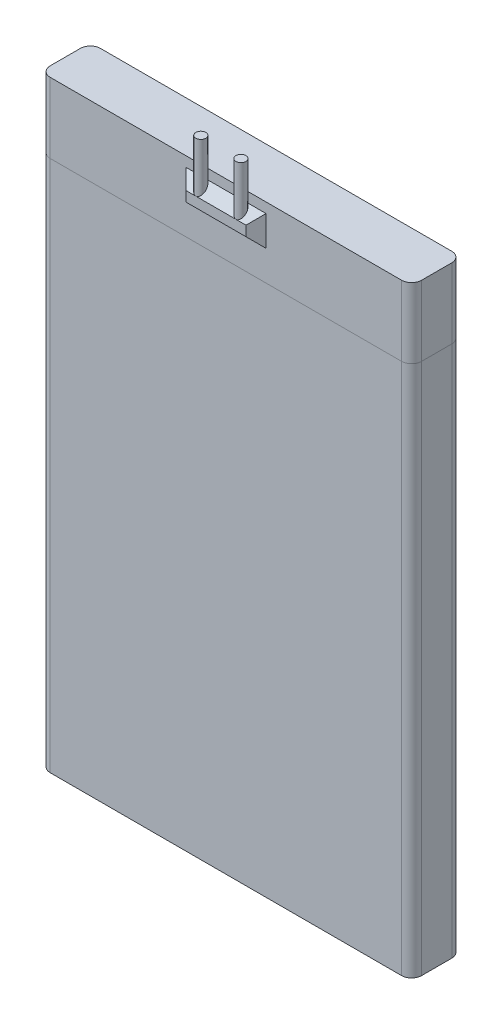
ISO-10303-21;
HEADER;
FILE_DESCRIPTION(('STEP AP214'),'2;1');
FILE_NAME('part.step','',(''),(''),'','','');
FILE_SCHEMA(('AUTOMOTIVE_DESIGN { 1 0 10303 214 1 1 1 1 }'));
ENDSEC;
DATA;
#1=APPLICATION_CONTEXT('core data for automotive mechanical design processes');
#2=APPLICATION_PROTOCOL_DEFINITION('international standard','automotive_design',2000,#1);
#3=PRODUCT_CONTEXT('',#1,'mechanical');
#4=PRODUCT('Part','Part','',(#3));
#5=PRODUCT_RELATED_PRODUCT_CATEGORY('part','',(#4));
#6=PRODUCT_DEFINITION_FORMATION('','',#4);
#7=PRODUCT_DEFINITION_CONTEXT('part definition',#1,'design');
#8=PRODUCT_DEFINITION('design','',#6,#7);
#9=PRODUCT_DEFINITION_SHAPE('','',#8);
#10=(LENGTH_UNIT() NAMED_UNIT(*) SI_UNIT(.MILLI.,.METRE.));
#11=(NAMED_UNIT(*) PLANE_ANGLE_UNIT() SI_UNIT($,.RADIAN.));
#12=(NAMED_UNIT(*) SI_UNIT($,.STERADIAN.) SOLID_ANGLE_UNIT());
#13=UNCERTAINTY_MEASURE_WITH_UNIT(LENGTH_MEASURE(1.E-05),#10,'distance_accuracy_value','');
#14=(GEOMETRIC_REPRESENTATION_CONTEXT(3) GLOBAL_UNCERTAINTY_ASSIGNED_CONTEXT((#13)) GLOBAL_UNIT_ASSIGNED_CONTEXT((#10,
#11,#12)) REPRESENTATION_CONTEXT('',''));
#15=CARTESIAN_POINT('',(0.,0.,0.));
#16=DIRECTION('',(0.,0.,1.));
#17=DIRECTION('',(1.,0.,0.));
#18=AXIS2_PLACEMENT_3D('',#15,#16,#17);
#19=CARTESIAN_POINT('',(0.,-3.5,0.));
#20=DIRECTION('',(0.,0.,1.));
#21=DIRECTION('',(1.,0.,0.));
#22=AXIS2_PLACEMENT_3D('',#19,#20,#21);
#23=PLANE('',#22);
#24=DIRECTION('',(0.,-1.,0.));
#25=VECTOR('',#24,1.);
#26=CARTESIAN_POINT('',(-17.5,9.75,0.));
#27=LINE('',#26,#25);
#28=CARTESIAN_POINT('',(-17.5,23.,0.));
#29=VERTEX_POINT('',#28);
#30=CARTESIAN_POINT('',(-17.5,-30.,0.));
#31=VERTEX_POINT('',#30);
#32=EDGE_CURVE('P0_E130',#29,#31,#27,.T.);
#33=ORIENTED_EDGE('',*,*,#32,.F.);
#34=DIRECTION('',(1.,0.,0.));
#35=VECTOR('',#34,1.);
#36=CARTESIAN_POINT('',(-18.5,23.,0.));
#37=LINE('',#36,#35);
#38=CARTESIAN_POINT('',(17.5,23.,0.));
#39=VERTEX_POINT('',#38);
#40=EDGE_CURVE('P0_E114',#29,#39,#37,.T.);
#41=ORIENTED_EDGE('',*,*,#40,.T.);
#42=DIRECTION('',(0.,1.,0.));
#43=VECTOR('',#42,1.);
#44=CARTESIAN_POINT('',(17.5,-16.75,0.));
#45=LINE('',#44,#43);
#46=CARTESIAN_POINT('',(17.5,-30.,0.));
#47=VERTEX_POINT('',#46);
#48=EDGE_CURVE('P0_E181',#47,#39,#45,.T.);
#49=ORIENTED_EDGE('',*,*,#48,.F.);
#50=DIRECTION('',(1.,0.,0.));
#51=VECTOR('',#50,1.);
#52=CARTESIAN_POINT('',(-18.5,-30.,0.));
#53=LINE('',#52,#51);
#54=EDGE_CURVE('P0_E11',#31,#47,#53,.T.);
#55=ORIENTED_EDGE('',*,*,#54,.F.);
#56=EDGE_LOOP('',(#33,#41,#49,#55));
#57=FACE_BOUND('',#56,.T.);
#58=ADVANCED_FACE('P0_F17',(#57),#23,.F.);
#59=CARTESIAN_POINT('',(-18.5,-30.,0.));
#60=DIRECTION('',(0.,-1.,0.));
#61=DIRECTION('',(0.,0.,-1.));
#62=AXIS2_PLACEMENT_3D('',#59,#60,#61);
#63=PLANE('',#62);
#64=CARTESIAN_POINT('',(-17.5,-30.,1.));
#65=DIRECTION('',(0.,1.,0.));
#66=DIRECTION('',(-0.707106781186548,0.,-0.707106781186547));
#67=AXIS2_PLACEMENT_3D('',#64,#65,#66);
#68=CIRCLE('',#67,1.);
#69=CARTESIAN_POINT('',(-18.5,-30.,1.));
#70=VERTEX_POINT('',#69);
#71=EDGE_CURVE('P0_E107',#31,#70,#68,.T.);
#72=ORIENTED_EDGE('',*,*,#71,.F.);
#73=ORIENTED_EDGE('',*,*,#54,.T.);
#74=CARTESIAN_POINT('',(17.5,-30.,1.));
#75=DIRECTION('',(0.,1.,0.));
#76=DIRECTION('',(0.707106781186548,0.,-0.707106781186547));
#77=AXIS2_PLACEMENT_3D('',#74,#75,#76);
#78=CIRCLE('',#77,1.);
#79=CARTESIAN_POINT('',(18.5,-30.,1.));
#80=VERTEX_POINT('',#79);
#81=EDGE_CURVE('P0_E177',#80,#47,#78,.T.);
#82=ORIENTED_EDGE('',*,*,#81,.F.);
#83=DIRECTION('',(0.,0.,1.));
#84=VECTOR('',#83,1.);
#85=CARTESIAN_POINT('',(18.5,-30.,0.));
#86=LINE('',#85,#84);
#87=CARTESIAN_POINT('',(18.5,-30.,4.));
#88=VERTEX_POINT('',#87);
#89=EDGE_CURVE('P0_E187',#80,#88,#86,.T.);
#90=ORIENTED_EDGE('',*,*,#89,.T.);
#91=CARTESIAN_POINT('',(17.5,-30.,4.));
#92=DIRECTION('',(0.,1.,0.));
#93=DIRECTION('',(0.707106781186548,0.,0.707106781186547));
#94=AXIS2_PLACEMENT_3D('',#91,#92,#93);
#95=CIRCLE('',#94,1.);
#96=CARTESIAN_POINT('',(17.5,-30.,5.));
#97=VERTEX_POINT('',#96);
#98=EDGE_CURVE('P0_E49',#97,#88,#95,.T.);
#99=ORIENTED_EDGE('',*,*,#98,.F.);
#100=DIRECTION('',(1.,0.,0.));
#101=VECTOR('',#100,1.);
#102=CARTESIAN_POINT('',(-18.5,-30.,5.));
#103=LINE('',#102,#101);
#104=CARTESIAN_POINT('',(-17.5,-30.,5.));
#105=VERTEX_POINT('',#104);
#106=EDGE_CURVE('P0_E21',#105,#97,#103,.T.);
#107=ORIENTED_EDGE('',*,*,#106,.F.);
#108=CARTESIAN_POINT('',(-17.5,-30.,4.));
#109=DIRECTION('',(0.,1.,0.));
#110=DIRECTION('',(-0.707106781186548,0.,0.707106781186547));
#111=AXIS2_PLACEMENT_3D('',#108,#109,#110);
#112=CIRCLE('',#111,1.);
#113=CARTESIAN_POINT('',(-18.5,-30.,4.));
#114=VERTEX_POINT('',#113);
#115=EDGE_CURVE('P0_E109',#114,#105,#112,.T.);
#116=ORIENTED_EDGE('',*,*,#115,.F.);
#117=DIRECTION('',(0.,0.,1.));
#118=VECTOR('',#117,1.);
#119=CARTESIAN_POINT('',(-18.5,-30.,0.));
#120=LINE('',#119,#118);
#121=EDGE_CURVE('P0_E104',#70,#114,#120,.T.);
#122=ORIENTED_EDGE('',*,*,#121,.F.);
#123=EDGE_LOOP('',(#72,#73,#82,#90,#99,#107,#116,#122));
#124=FACE_BOUND('',#123,.T.);
#125=ADVANCED_FACE('P0_F19',(#124),#63,.T.);
#126=CARTESIAN_POINT('',(0.,-3.5,5.));
#127=DIRECTION('',(0.,0.,1.));
#128=DIRECTION('',(1.,0.,0.));
#129=AXIS2_PLACEMENT_3D('',#126,#127,#128);
#130=PLANE('',#129);
#131=DIRECTION('',(0.,1.,0.));
#132=VECTOR('',#131,1.);
#133=CARTESIAN_POINT('',(-17.5,9.75,5.));
#134=LINE('',#133,#132);
#135=CARTESIAN_POINT('',(-17.5,23.,5.));
#136=VERTEX_POINT('',#135);
#137=EDGE_CURVE('P0_E147',#105,#136,#134,.T.);
#138=ORIENTED_EDGE('',*,*,#137,.F.);
#139=ORIENTED_EDGE('',*,*,#106,.T.);
#140=DIRECTION('',(0.,-1.,0.));
#141=VECTOR('',#140,1.);
#142=CARTESIAN_POINT('',(17.5,-16.75,5.));
#143=LINE('',#142,#141);
#144=CARTESIAN_POINT('',(17.5,23.,5.));
#145=VERTEX_POINT('',#144);
#146=EDGE_CURVE('P0_E190',#145,#97,#143,.T.);
#147=ORIENTED_EDGE('',*,*,#146,.F.);
#148=DIRECTION('',(-1.,0.,0.));
#149=VECTOR('',#148,1.);
#150=CARTESIAN_POINT('',(-18.5,23.,5.));
#151=LINE('',#150,#149);
#152=EDGE_CURVE('P0_E154',#145,#136,#151,.T.);
#153=ORIENTED_EDGE('',*,*,#152,.T.);
#154=EDGE_LOOP('',(#138,#139,#147,#153));
#155=FACE_BOUND('',#154,.T.);
#156=ADVANCED_FACE('P0_F210',(#155),#130,.T.);
#157=CARTESIAN_POINT('',(17.5,-16.75,4.));
#158=DIRECTION('',(0.,1.,0.));
#159=DIRECTION('',(0.707106781186548,0.,0.707106781186547));
#160=AXIS2_PLACEMENT_3D('',#157,#158,#159);
#161=CYLINDRICAL_SURFACE('',#160,1.);
#162=CARTESIAN_POINT('',(17.5,23.,4.));
#163=DIRECTION('',(0.,-1.,0.));
#164=DIRECTION('',(0.707106781186548,0.,0.707106781186547));
#165=AXIS2_PLACEMENT_3D('',#162,#163,#164);
#166=CIRCLE('',#165,1.);
#167=CARTESIAN_POINT('',(18.5,23.,4.));
#168=VERTEX_POINT('',#167);
#169=EDGE_CURVE('P0_E157',#168,#145,#166,.T.);
#170=ORIENTED_EDGE('',*,*,#169,.T.);
#171=ORIENTED_EDGE('',*,*,#146,.T.);
#172=ORIENTED_EDGE('',*,*,#98,.T.);
#173=DIRECTION('',(0.,1.,0.));
#174=VECTOR('',#173,1.);
#175=CARTESIAN_POINT('',(18.5,-16.75,4.));
#176=LINE('',#175,#174);
#177=EDGE_CURVE('P0_E184',#88,#168,#176,.T.);
#178=ORIENTED_EDGE('',*,*,#177,.T.);
#179=EDGE_LOOP('',(#170,#171,#172,#178));
#180=FACE_BOUND('',#179,.T.);
#181=ADVANCED_FACE('P0_F217',(#180),#161,.T.);
#182=CARTESIAN_POINT('',(18.5,-30.,0.));
#183=DIRECTION('',(1.,0.,0.));
#184=DIRECTION('',(0.,1.,0.));
#185=AXIS2_PLACEMENT_3D('',#182,#183,#184);
#186=PLANE('',#185);
#187=DIRECTION('',(0.,-1.,0.));
#188=VECTOR('',#187,1.);
#189=CARTESIAN_POINT('',(18.5,-16.75,1.));
#190=LINE('',#189,#188);
#191=CARTESIAN_POINT('',(18.5,23.,1.));
#192=VERTEX_POINT('',#191);
#193=EDGE_CURVE('P0_E169',#192,#80,#190,.T.);
#194=ORIENTED_EDGE('',*,*,#193,.F.);
#195=DIRECTION('',(0.,0.,1.));
#196=VECTOR('',#195,1.);
#197=CARTESIAN_POINT('',(18.5,23.,0.));
#198=LINE('',#197,#196);
#199=EDGE_CURVE('P0_E161',#192,#168,#198,.T.);
#200=ORIENTED_EDGE('',*,*,#199,.T.);
#201=ORIENTED_EDGE('',*,*,#177,.F.);
#202=ORIENTED_EDGE('',*,*,#89,.F.);
#203=EDGE_LOOP('',(#194,#200,#201,#202));
#204=FACE_BOUND('',#203,.T.);
#205=ADVANCED_FACE('P0_F229',(#204),#186,.T.);
#206=CARTESIAN_POINT('',(17.5,-16.75,1.));
#207=DIRECTION('',(0.,1.,0.));
#208=DIRECTION('',(0.707106781186548,0.,-0.707106781186547));
#209=AXIS2_PLACEMENT_3D('',#206,#207,#208);
#210=CYLINDRICAL_SURFACE('',#209,1.);
#211=CARTESIAN_POINT('',(17.5,23.,1.));
#212=DIRECTION('',(0.,-1.,0.));
#213=DIRECTION('',(0.707106781186548,0.,-0.707106781186547));
#214=AXIS2_PLACEMENT_3D('',#211,#212,#213);
#215=CIRCLE('',#214,1.);
#216=EDGE_CURVE('P0_E142',#39,#192,#215,.T.);
#217=ORIENTED_EDGE('',*,*,#216,.T.);
#218=ORIENTED_EDGE('',*,*,#193,.T.);
#219=ORIENTED_EDGE('',*,*,#81,.T.);
#220=ORIENTED_EDGE('',*,*,#48,.T.);
#221=EDGE_LOOP('',(#217,#218,#219,#220));
#222=FACE_BOUND('',#221,.T.);
#223=ADVANCED_FACE('P0_F233',(#222),#210,.T.);
#224=CARTESIAN_POINT('',(-17.5,9.75,4.));
#225=DIRECTION('',(0.,-1.,0.));
#226=DIRECTION('',(-0.707106781186548,0.,0.707106781186547));
#227=AXIS2_PLACEMENT_3D('',#224,#225,#226);
#228=CYLINDRICAL_SURFACE('',#227,1.);
#229=ORIENTED_EDGE('',*,*,#115,.T.);
#230=ORIENTED_EDGE('',*,*,#137,.T.);
#231=CARTESIAN_POINT('',(-17.5,23.,4.));
#232=DIRECTION('',(0.,-1.,0.));
#233=DIRECTION('',(-0.707106781186548,0.,0.707106781186547));
#234=AXIS2_PLACEMENT_3D('',#231,#232,#233);
#235=CIRCLE('',#234,1.);
#236=CARTESIAN_POINT('',(-18.5,23.,4.));
#237=VERTEX_POINT('',#236);
#238=EDGE_CURVE('P0_E150',#136,#237,#235,.T.);
#239=ORIENTED_EDGE('',*,*,#238,.T.);
#240=DIRECTION('',(0.,-1.,0.));
#241=VECTOR('',#240,1.);
#242=CARTESIAN_POINT('',(-18.5,9.75,4.));
#243=LINE('',#242,#241);
#244=EDGE_CURVE('P0_E113',#237,#114,#243,.T.);
#245=ORIENTED_EDGE('',*,*,#244,.T.);
#246=EDGE_LOOP('',(#229,#230,#239,#245));
#247=FACE_BOUND('',#246,.T.);
#248=ADVANCED_FACE('P0_F242',(#247),#228,.T.);
#249=CARTESIAN_POINT('',(-18.5,23.,0.));
#250=DIRECTION('',(-1.,0.,0.));
#251=DIRECTION('',(0.,0.,1.));
#252=AXIS2_PLACEMENT_3D('',#249,#250,#251);
#253=PLANE('',#252);
#254=DIRECTION('',(0.,1.,0.));
#255=VECTOR('',#254,1.);
#256=CARTESIAN_POINT('',(-18.5,9.75,1.));
#257=LINE('',#256,#255);
#258=CARTESIAN_POINT('',(-18.5,23.,1.));
#259=VERTEX_POINT('',#258);
#260=EDGE_CURVE('P0_E117',#70,#259,#257,.T.);
#261=ORIENTED_EDGE('',*,*,#260,.F.);
#262=ORIENTED_EDGE('',*,*,#121,.T.);
#263=ORIENTED_EDGE('',*,*,#244,.F.);
#264=DIRECTION('',(0.,0.,1.));
#265=VECTOR('',#264,1.);
#266=CARTESIAN_POINT('',(-18.5,23.,0.));
#267=LINE('',#266,#265);
#268=EDGE_CURVE('P0_E120',#259,#237,#267,.T.);
#269=ORIENTED_EDGE('',*,*,#268,.F.);
#270=EDGE_LOOP('',(#261,#262,#263,#269));
#271=FACE_BOUND('',#270,.T.);
#272=ADVANCED_FACE('P0_F118',(#271),#253,.T.);
#273=CARTESIAN_POINT('',(18.5,23.,0.));
#274=DIRECTION('',(0.,1.,0.));
#275=DIRECTION('',(1.,0.,0.));
#276=AXIS2_PLACEMENT_3D('',#273,#274,#275);
#277=PLANE('',#276);
#278=CARTESIAN_POINT('',(-17.5,23.,1.));
#279=DIRECTION('',(0.,-1.,0.));
#280=DIRECTION('',(-0.707106781186548,0.,-0.707106781186547));
#281=AXIS2_PLACEMENT_3D('',#278,#279,#280);
#282=CIRCLE('',#281,1.);
#283=EDGE_CURVE('P0_E125',#259,#29,#282,.T.);
#284=ORIENTED_EDGE('',*,*,#283,.F.);
#285=ORIENTED_EDGE('',*,*,#268,.T.);
#286=ORIENTED_EDGE('',*,*,#238,.F.);
#287=ORIENTED_EDGE('',*,*,#152,.F.);
#288=ORIENTED_EDGE('',*,*,#169,.F.);
#289=ORIENTED_EDGE('',*,*,#199,.F.);
#290=ORIENTED_EDGE('',*,*,#216,.F.);
#291=ORIENTED_EDGE('',*,*,#40,.F.);
#292=EDGE_LOOP('',(#284,#285,#286,#287,#288,#289,#290,#291));
#293=FACE_BOUND('',#292,.T.);
#294=ADVANCED_FACE('P0_F259',(#293),#277,.T.);
#295=CARTESIAN_POINT('',(-17.5,9.75,1.));
#296=DIRECTION('',(0.,-1.,0.));
#297=DIRECTION('',(-0.707106781186548,0.,-0.707106781186547));
#298=AXIS2_PLACEMENT_3D('',#295,#296,#297);
#299=CYLINDRICAL_SURFACE('',#298,1.);
#300=ORIENTED_EDGE('',*,*,#71,.T.);
#301=ORIENTED_EDGE('',*,*,#260,.T.);
#302=ORIENTED_EDGE('',*,*,#283,.T.);
#303=ORIENTED_EDGE('',*,*,#32,.T.);
#304=EDGE_LOOP('',(#300,#301,#302,#303));
#305=FACE_BOUND('',#304,.T.);
#306=ADVANCED_FACE('P0_F128',(#305),#299,.T.);
#307=CLOSED_SHELL('',(#58,#125,#156,#181,#205,#223,#248,#272,#294,#306));
#308=MANIFOLD_SOLID_BREP('P0_B1',#307);
#309=CARTESIAN_POINT('',(0.,26.5,0.));
#310=DIRECTION('',(0.,0.,1.));
#311=DIRECTION('',(1.,0.,0.));
#312=AXIS2_PLACEMENT_3D('',#309,#310,#311);
#313=PLANE('',#312);
#314=DIRECTION('',(0.,-1.,0.));
#315=VECTOR('',#314,1.);
#316=CARTESIAN_POINT('',(-17.5,28.25,0.));
#317=LINE('',#316,#315);
#318=CARTESIAN_POINT('',(-17.5,30.,0.));
#319=VERTEX_POINT('',#318);
#320=CARTESIAN_POINT('',(-17.5,23.,0.));
#321=VERTEX_POINT('',#320);
#322=EDGE_CURVE('P1_E163',#319,#321,#317,.T.);
#323=ORIENTED_EDGE('',*,*,#322,.F.);
#324=DIRECTION('',(-1.,0.,0.));
#325=VECTOR('',#324,1.);
#326=CARTESIAN_POINT('',(18.5,30.,0.));
#327=LINE('',#326,#325);
#328=CARTESIAN_POINT('',(17.5,30.,0.));
#329=VERTEX_POINT('',#328);
#330=EDGE_CURVE('P1_E186',#329,#319,#327,.T.);
#331=ORIENTED_EDGE('',*,*,#330,.F.);
#332=DIRECTION('',(0.,1.,0.));
#333=VECTOR('',#332,1.);
#334=CARTESIAN_POINT('',(17.5,24.75,0.));
#335=LINE('',#334,#333);
#336=CARTESIAN_POINT('',(17.5,23.,0.));
#337=VERTEX_POINT('',#336);
#338=EDGE_CURVE('P1_E200',#337,#329,#335,.T.);
#339=ORIENTED_EDGE('',*,*,#338,.F.);
#340=DIRECTION('',(1.,0.,0.));
#341=VECTOR('',#340,1.);
#342=CARTESIAN_POINT('',(-18.5,23.,0.));
#343=LINE('',#342,#341);
#344=EDGE_CURVE('P1_E11',#321,#337,#343,.T.);
#345=ORIENTED_EDGE('',*,*,#344,.F.);
#346=EDGE_LOOP('',(#323,#331,#339,#345));
#347=FACE_BOUND('',#346,.T.);
#348=ADVANCED_FACE('P1_F17',(#347),#313,.F.);
#349=CARTESIAN_POINT('',(-18.5,23.,0.));
#350=DIRECTION('',(0.,-1.,0.));
#351=DIRECTION('',(0.,0.,-1.));
#352=AXIS2_PLACEMENT_3D('',#349,#350,#351);
#353=PLANE('',#352);
#354=CARTESIAN_POINT('',(-17.5,23.,1.));
#355=DIRECTION('',(0.,1.,0.));
#356=DIRECTION('',(-0.707106781186548,0.,-0.707106781186547));
#357=AXIS2_PLACEMENT_3D('',#354,#355,#356);
#358=CIRCLE('',#357,1.);
#359=CARTESIAN_POINT('',(-18.5,23.,1.));
#360=VERTEX_POINT('',#359);
#361=EDGE_CURVE('P1_E233',#321,#360,#358,.T.);
#362=ORIENTED_EDGE('',*,*,#361,.F.);
#363=ORIENTED_EDGE('',*,*,#344,.T.);
#364=CARTESIAN_POINT('',(17.5,23.,1.));
#365=DIRECTION('',(0.,1.,0.));
#366=DIRECTION('',(0.707106781186548,0.,-0.707106781186547));
#367=AXIS2_PLACEMENT_3D('',#364,#365,#366);
#368=CIRCLE('',#367,1.);
#369=CARTESIAN_POINT('',(18.5,23.,1.));
#370=VERTEX_POINT('',#369);
#371=EDGE_CURVE('P1_E199',#370,#337,#368,.T.);
#372=ORIENTED_EDGE('',*,*,#371,.F.);
#373=DIRECTION('',(0.,0.,1.));
#374=VECTOR('',#373,1.);
#375=CARTESIAN_POINT('',(18.5,23.,0.));
#376=LINE('',#375,#374);
#377=CARTESIAN_POINT('',(18.5,23.,4.));
#378=VERTEX_POINT('',#377);
#379=EDGE_CURVE('P1_E206',#370,#378,#376,.T.);
#380=ORIENTED_EDGE('',*,*,#379,.T.);
#381=CARTESIAN_POINT('',(17.5,23.,4.));
#382=DIRECTION('',(0.,1.,0.));
#383=DIRECTION('',(0.707106781186548,0.,0.707106781186547));
#384=AXIS2_PLACEMENT_3D('',#381,#382,#383);
#385=CIRCLE('',#384,1.);
#386=CARTESIAN_POINT('',(17.5,23.,5.));
#387=VERTEX_POINT('',#386);
#388=EDGE_CURVE('P1_E46',#387,#378,#385,.T.);
#389=ORIENTED_EDGE('',*,*,#388,.F.);
#390=DIRECTION('',(1.,0.,0.));
#391=VECTOR('',#390,1.);
#392=CARTESIAN_POINT('',(-18.5,23.,5.));
#393=LINE('',#392,#391);
#394=CARTESIAN_POINT('',(-17.5,23.,5.));
#395=VERTEX_POINT('',#394);
#396=EDGE_CURVE('P1_E26',#395,#387,#393,.T.);
#397=ORIENTED_EDGE('',*,*,#396,.F.);
#398=CARTESIAN_POINT('',(-17.5,23.,4.));
#399=DIRECTION('',(0.,1.,0.));
#400=DIRECTION('',(-0.707106781186548,0.,0.707106781186547));
#401=AXIS2_PLACEMENT_3D('',#398,#399,#400);
#402=CIRCLE('',#401,1.);
#403=CARTESIAN_POINT('',(-18.5,23.,4.));
#404=VERTEX_POINT('',#403);
#405=EDGE_CURVE('P1_E146',#404,#395,#402,.T.);
#406=ORIENTED_EDGE('',*,*,#405,.F.);
#407=DIRECTION('',(0.,0.,1.));
#408=VECTOR('',#407,1.);
#409=CARTESIAN_POINT('',(-18.5,23.,0.));
#410=LINE('',#409,#408);
#411=EDGE_CURVE('P1_E142',#360,#404,#410,.T.);
#412=ORIENTED_EDGE('',*,*,#411,.F.);
#413=EDGE_LOOP('',(#362,#363,#372,#380,#389,#397,#406,#412));
#414=FACE_BOUND('',#413,.T.);
#415=ADVANCED_FACE('P1_F19',(#414),#353,.T.);
#416=CARTESIAN_POINT('',(0.,26.5,5.));
#417=DIRECTION('',(0.,0.,1.));
#418=DIRECTION('',(1.,0.,0.));
#419=AXIS2_PLACEMENT_3D('',#416,#417,#418);
#420=PLANE('',#419);
#421=DIRECTION('',(1.,0.,0.));
#422=VECTOR('',#421,1.);
#423=CARTESIAN_POINT('',(2.,29.,5.));
#424=LINE('',#423,#422);
#425=CARTESIAN_POINT('',(-4.,29.,5.));
#426=VERTEX_POINT('',#425);
#427=CARTESIAN_POINT('',(4.,29.,5.));
#428=VERTEX_POINT('',#427);
#429=EDGE_CURVE('P1_E258',#426,#428,#424,.T.);
#430=ORIENTED_EDGE('',*,*,#429,.T.);
#431=DIRECTION('',(0.,-1.,0.));
#432=VECTOR('',#431,1.);
#433=CARTESIAN_POINT('',(4.,26.25,5.));
#434=LINE('',#433,#432);
#435=CARTESIAN_POINT('',(4.,26.,5.));
#436=VERTEX_POINT('',#435);
#437=EDGE_CURVE('P1_E222',#428,#436,#434,.T.);
#438=ORIENTED_EDGE('',*,*,#437,.T.);
#439=DIRECTION('',(-1.,0.,0.));
#440=VECTOR('',#439,1.);
#441=CARTESIAN_POINT('',(-2.,26.,5.));
#442=LINE('',#441,#440);
#443=CARTESIAN_POINT('',(-4.,26.,5.));
#444=VERTEX_POINT('',#443);
#445=EDGE_CURVE('P1_E226',#436,#444,#442,.T.);
#446=ORIENTED_EDGE('',*,*,#445,.T.);
#447=DIRECTION('',(0.,1.,0.));
#448=VECTOR('',#447,1.);
#449=CARTESIAN_POINT('',(-4.,27.75,5.));
#450=LINE('',#449,#448);
#451=EDGE_CURVE('P1_E278',#444,#426,#450,.T.);
#452=ORIENTED_EDGE('',*,*,#451,.T.);
#453=EDGE_LOOP('',(#430,#438,#446,#452));
#454=FACE_BOUND('',#453,.T.);
#455=DIRECTION('',(0.,1.,0.));
#456=VECTOR('',#455,1.);
#457=CARTESIAN_POINT('',(-17.5,28.25,5.));
#458=LINE('',#457,#456);
#459=CARTESIAN_POINT('',(-17.5,30.,5.));
#460=VERTEX_POINT('',#459);
#461=EDGE_CURVE('P1_E151',#395,#460,#458,.T.);
#462=ORIENTED_EDGE('',*,*,#461,.F.);
#463=ORIENTED_EDGE('',*,*,#396,.T.);
#464=DIRECTION('',(0.,-1.,0.));
#465=VECTOR('',#464,1.);
#466=CARTESIAN_POINT('',(17.5,24.75,5.));
#467=LINE('',#466,#465);
#468=CARTESIAN_POINT('',(17.5,30.,5.));
#469=VERTEX_POINT('',#468);
#470=EDGE_CURVE('P1_E209',#469,#387,#467,.T.);
#471=ORIENTED_EDGE('',*,*,#470,.F.);
#472=DIRECTION('',(-1.,0.,0.));
#473=VECTOR('',#472,1.);
#474=CARTESIAN_POINT('',(18.5,30.,5.));
#475=LINE('',#474,#473);
#476=EDGE_CURVE('P1_E156',#469,#460,#475,.T.);
#477=ORIENTED_EDGE('',*,*,#476,.T.);
#478=EDGE_LOOP('',(#462,#463,#471,#477));
#479=FACE_BOUND('',#478,.T.);
#480=ADVANCED_FACE('P1_F252',(#454,#479),#420,.T.);
#481=CARTESIAN_POINT('',(17.5,24.75,4.));
#482=DIRECTION('',(0.,1.,0.));
#483=DIRECTION('',(0.707106781186548,0.,0.707106781186547));
#484=AXIS2_PLACEMENT_3D('',#481,#482,#483);
#485=CYLINDRICAL_SURFACE('',#484,1.);
#486=CARTESIAN_POINT('',(17.5,30.,4.));
#487=DIRECTION('',(0.,-1.,0.));
#488=DIRECTION('',(0.707106781186548,0.,0.707106781186547));
#489=AXIS2_PLACEMENT_3D('',#486,#487,#488);
#490=CIRCLE('',#489,1.);
#491=CARTESIAN_POINT('',(18.5,30.,4.));
#492=VERTEX_POINT('',#491);
#493=EDGE_CURVE('P1_E174',#492,#469,#490,.T.);
#494=ORIENTED_EDGE('',*,*,#493,.T.);
#495=ORIENTED_EDGE('',*,*,#470,.T.);
#496=ORIENTED_EDGE('',*,*,#388,.T.);
#497=DIRECTION('',(0.,1.,0.));
#498=VECTOR('',#497,1.);
#499=CARTESIAN_POINT('',(18.5,24.75,4.));
#500=LINE('',#499,#498);
#501=EDGE_CURVE('P1_E203',#378,#492,#500,.T.);
#502=ORIENTED_EDGE('',*,*,#501,.T.);
#503=EDGE_LOOP('',(#494,#495,#496,#502));
#504=FACE_BOUND('',#503,.T.);
#505=ADVANCED_FACE('P1_F394',(#504),#485,.T.);
#506=CARTESIAN_POINT('',(18.5,23.,0.));
#507=DIRECTION('',(1.,0.,0.));
#508=DIRECTION('',(0.,1.,0.));
#509=AXIS2_PLACEMENT_3D('',#506,#507,#508);
#510=PLANE('',#509);
#511=DIRECTION('',(0.,-1.,0.));
#512=VECTOR('',#511,1.);
#513=CARTESIAN_POINT('',(18.5,24.75,1.));
#514=LINE('',#513,#512);
#515=CARTESIAN_POINT('',(18.5,30.,1.));
#516=VERTEX_POINT('',#515);
#517=EDGE_CURVE('P1_E195',#516,#370,#514,.T.);
#518=ORIENTED_EDGE('',*,*,#517,.F.);
#519=DIRECTION('',(0.,0.,1.));
#520=VECTOR('',#519,1.);
#521=CARTESIAN_POINT('',(18.5,30.,0.));
#522=LINE('',#521,#520);
#523=EDGE_CURVE('P1_E178',#516,#492,#522,.T.);
#524=ORIENTED_EDGE('',*,*,#523,.T.);
#525=ORIENTED_EDGE('',*,*,#501,.F.);
#526=ORIENTED_EDGE('',*,*,#379,.F.);
#527=EDGE_LOOP('',(#518,#524,#525,#526));
#528=FACE_BOUND('',#527,.T.);
#529=ADVANCED_FACE('P1_F399',(#528),#510,.T.);
#530=CARTESIAN_POINT('',(17.5,24.75,1.));
#531=DIRECTION('',(0.,1.,0.));
#532=DIRECTION('',(0.707106781186548,0.,-0.707106781186547));
#533=AXIS2_PLACEMENT_3D('',#530,#531,#532);
#534=CYLINDRICAL_SURFACE('',#533,1.);
#535=CARTESIAN_POINT('',(17.5,30.,1.));
#536=DIRECTION('',(0.,-1.,0.));
#537=DIRECTION('',(0.707106781186548,0.,-0.707106781186547));
#538=AXIS2_PLACEMENT_3D('',#535,#536,#537);
#539=CIRCLE('',#538,1.);
#540=EDGE_CURVE('P1_E182',#329,#516,#539,.T.);
#541=ORIENTED_EDGE('',*,*,#540,.T.);
#542=ORIENTED_EDGE('',*,*,#517,.T.);
#543=ORIENTED_EDGE('',*,*,#371,.T.);
#544=ORIENTED_EDGE('',*,*,#338,.T.);
#545=EDGE_LOOP('',(#541,#542,#543,#544));
#546=FACE_BOUND('',#545,.T.);
#547=ADVANCED_FACE('P1_F443',(#546),#534,.T.);
#548=CARTESIAN_POINT('',(-17.5,28.25,4.));
#549=DIRECTION('',(0.,-1.,0.));
#550=DIRECTION('',(-0.707106781186548,0.,0.707106781186547));
#551=AXIS2_PLACEMENT_3D('',#548,#549,#550);
#552=CYLINDRICAL_SURFACE('',#551,1.);
#553=ORIENTED_EDGE('',*,*,#405,.T.);
#554=ORIENTED_EDGE('',*,*,#461,.T.);
#555=CARTESIAN_POINT('',(-17.5,30.,4.));
#556=DIRECTION('',(0.,-1.,0.));
#557=DIRECTION('',(-0.707106781186548,0.,0.707106781186547));
#558=AXIS2_PLACEMENT_3D('',#555,#556,#557);
#559=CIRCLE('',#558,1.);
#560=CARTESIAN_POINT('',(-18.5,30.,4.));
#561=VERTEX_POINT('',#560);
#562=EDGE_CURVE('P1_E149',#460,#561,#559,.T.);
#563=ORIENTED_EDGE('',*,*,#562,.T.);
#564=DIRECTION('',(0.,-1.,0.));
#565=VECTOR('',#564,1.);
#566=CARTESIAN_POINT('',(-18.5,28.25,4.));
#567=LINE('',#566,#565);
#568=EDGE_CURVE('P1_E135',#561,#404,#567,.T.);
#569=ORIENTED_EDGE('',*,*,#568,.T.);
#570=EDGE_LOOP('',(#553,#554,#563,#569));
#571=FACE_BOUND('',#570,.T.);
#572=ADVANCED_FACE('P1_F150',(#571),#552,.T.);
#573=CARTESIAN_POINT('',(-18.5,30.,0.));
#574=DIRECTION('',(-1.,0.,0.));
#575=DIRECTION('',(0.,0.,1.));
#576=AXIS2_PLACEMENT_3D('',#573,#574,#575);
#577=PLANE('',#576);
#578=DIRECTION('',(0.,1.,0.));
#579=VECTOR('',#578,1.);
#580=CARTESIAN_POINT('',(-18.5,28.25,1.));
#581=LINE('',#580,#579);
#582=CARTESIAN_POINT('',(-18.5,30.,1.));
#583=VERTEX_POINT('',#582);
#584=EDGE_CURVE('P1_E236',#360,#583,#581,.T.);
#585=ORIENTED_EDGE('',*,*,#584,.F.);
#586=ORIENTED_EDGE('',*,*,#411,.T.);
#587=ORIENTED_EDGE('',*,*,#568,.F.);
#588=DIRECTION('',(0.,0.,1.));
#589=VECTOR('',#588,1.);
#590=CARTESIAN_POINT('',(-18.5,30.,0.));
#591=LINE('',#590,#589);
#592=EDGE_CURVE('P1_E140',#583,#561,#591,.T.);
#593=ORIENTED_EDGE('',*,*,#592,.F.);
#594=EDGE_LOOP('',(#585,#586,#587,#593));
#595=FACE_BOUND('',#594,.T.);
#596=ADVANCED_FACE('P1_F138',(#595),#577,.T.);
#597=CARTESIAN_POINT('',(18.5,30.,0.));
#598=DIRECTION('',(0.,1.,0.));
#599=DIRECTION('',(1.,0.,0.));
#600=AXIS2_PLACEMENT_3D('',#597,#598,#599);
#601=PLANE('',#600);
#602=CARTESIAN_POINT('',(-17.5,30.,1.));
#603=DIRECTION('',(0.,-1.,0.));
#604=DIRECTION('',(-0.707106781186548,0.,-0.707106781186547));
#605=AXIS2_PLACEMENT_3D('',#602,#603,#604);
#606=CIRCLE('',#605,1.);
#607=EDGE_CURVE('P1_E160',#583,#319,#606,.T.);
#608=ORIENTED_EDGE('',*,*,#607,.F.);
#609=ORIENTED_EDGE('',*,*,#592,.T.);
#610=ORIENTED_EDGE('',*,*,#562,.F.);
#611=ORIENTED_EDGE('',*,*,#476,.F.);
#612=ORIENTED_EDGE('',*,*,#493,.F.);
#613=ORIENTED_EDGE('',*,*,#523,.F.);
#614=ORIENTED_EDGE('',*,*,#540,.F.);
#615=ORIENTED_EDGE('',*,*,#330,.T.);
#616=EDGE_LOOP('',(#608,#609,#610,#611,#612,#613,#614,#615));
#617=FACE_BOUND('',#616,.T.);
#618=ADVANCED_FACE('P1_F158',(#617),#601,.T.);
#619=CARTESIAN_POINT('',(-17.5,28.25,1.));
#620=DIRECTION('',(0.,-1.,0.));
#621=DIRECTION('',(-0.707106781186548,0.,-0.707106781186547));
#622=AXIS2_PLACEMENT_3D('',#619,#620,#621);
#623=CYLINDRICAL_SURFACE('',#622,1.);
#624=ORIENTED_EDGE('',*,*,#361,.T.);
#625=ORIENTED_EDGE('',*,*,#584,.T.);
#626=ORIENTED_EDGE('',*,*,#607,.T.);
#627=ORIENTED_EDGE('',*,*,#322,.T.);
#628=EDGE_LOOP('',(#624,#625,#626,#627));
#629=FACE_BOUND('',#628,.T.);
#630=ADVANCED_FACE('P1_F244',(#629),#623,.T.);
#631=CARTESIAN_POINT('',(0.,27.5,6.));
#632=DIRECTION('',(0.,0.,1.));
#633=DIRECTION('',(1.,0.,0.));
#634=AXIS2_PLACEMENT_3D('',#631,#632,#633);
#635=PLANE('',#634);
#636=DIRECTION('',(0.,1.,0.));
#637=VECTOR('',#636,1.);
#638=CARTESIAN_POINT('',(-3.,28.25,6.));
#639=LINE('',#638,#637);
#640=CARTESIAN_POINT('',(-3.,27.,6.));
#641=VERTEX_POINT('',#640);
#642=CARTESIAN_POINT('',(-3.,28.,6.));
#643=VERTEX_POINT('',#642);
#644=EDGE_CURVE('P1_E283',#641,#643,#639,.T.);
#645=ORIENTED_EDGE('',*,*,#644,.F.);
#646=DIRECTION('',(-1.,0.,0.));
#647=VECTOR('',#646,1.);
#648=CARTESIAN_POINT('',(-2.,27.,6.));
#649=LINE('',#648,#647);
#650=CARTESIAN_POINT('',(3.,27.,6.));
#651=VERTEX_POINT('',#650);
#652=EDGE_CURVE('P1_E220',#651,#641,#649,.T.);
#653=ORIENTED_EDGE('',*,*,#652,.F.);
#654=DIRECTION('',(0.,-1.,0.));
#655=VECTOR('',#654,1.);
#656=CARTESIAN_POINT('',(3.,26.75,6.));
#657=LINE('',#656,#655);
#658=CARTESIAN_POINT('',(3.,28.,6.));
#659=VERTEX_POINT('',#658);
#660=EDGE_CURVE('P1_E262',#659,#651,#657,.T.);
#661=ORIENTED_EDGE('',*,*,#660,.F.);
#662=DIRECTION('',(1.,0.,0.));
#663=VECTOR('',#662,1.);
#664=CARTESIAN_POINT('',(2.,28.,6.));
#665=LINE('',#664,#663);
#666=EDGE_CURVE('P1_E267',#643,#659,#665,.T.);
#667=ORIENTED_EDGE('',*,*,#666,.F.);
#668=EDGE_LOOP('',(#645,#653,#661,#667));
#669=FACE_BOUND('',#668,.T.);
#670=ADVANCED_FACE('P1_F308',(#669),#635,.T.);
#671=CARTESIAN_POINT('',(-2.,26.5,5.5));
#672=DIRECTION('',(0.,-0.707106781186547,0.707106781186548));
#673=DIRECTION('',(-1.,0.,0.));
#674=AXIS2_PLACEMENT_3D('',#671,#672,#673);
#675=PLANE('',#674);
#676=ORIENTED_EDGE('',*,*,#445,.F.);
#677=DIRECTION('',(0.577350269189626,-0.577350269189626,-0.577350269189625));
#678=VECTOR('',#677,1.);
#679=CARTESIAN_POINT('',(3.,27.,6.));
#680=LINE('',#679,#678);
#681=EDGE_CURVE('P1_E227',#651,#436,#680,.T.);
#682=ORIENTED_EDGE('',*,*,#681,.F.);
#683=ORIENTED_EDGE('',*,*,#652,.T.);
#684=DIRECTION('',(-0.577350269189626,-0.577350269189626,-0.577350269189626));
#685=VECTOR('',#684,1.);
#686=CARTESIAN_POINT('',(-3.,27.,6.));
#687=LINE('',#686,#685);
#688=EDGE_CURVE('P1_E271',#641,#444,#687,.T.);
#689=ORIENTED_EDGE('',*,*,#688,.T.);
#690=EDGE_LOOP('',(#676,#682,#683,#689));
#691=FACE_BOUND('',#690,.T.);
#692=ADVANCED_FACE('P1_F299',(#691),#675,.T.);
#693=CARTESIAN_POINT('',(3.5,26.75,5.5));
#694=DIRECTION('',(0.707106781186548,0.,0.707106781186548));
#695=DIRECTION('',(0.,-1.,0.));
#696=AXIS2_PLACEMENT_3D('',#693,#694,#695);
#697=PLANE('',#696);
#698=ORIENTED_EDGE('',*,*,#660,.T.);
#699=ORIENTED_EDGE('',*,*,#681,.T.);
#700=ORIENTED_EDGE('',*,*,#437,.F.);
#701=DIRECTION('',(0.577350269189626,0.577350269189626,-0.577350269189626));
#702=VECTOR('',#701,1.);
#703=CARTESIAN_POINT('',(3.,28.,6.));
#704=LINE('',#703,#702);
#705=EDGE_CURVE('P1_E263',#659,#428,#704,.T.);
#706=ORIENTED_EDGE('',*,*,#705,.F.);
#707=EDGE_LOOP('',(#698,#699,#700,#706));
#708=FACE_BOUND('',#707,.T.);
#709=ADVANCED_FACE('P1_F296',(#708),#697,.T.);
#710=CARTESIAN_POINT('',(2.,28.5,5.5));
#711=DIRECTION('',(0.,0.707106781186547,0.707106781186548));
#712=DIRECTION('',(1.,0.,0.));
#713=AXIS2_PLACEMENT_3D('',#710,#711,#712);
#714=PLANE('',#713);
#715=ORIENTED_EDGE('',*,*,#666,.T.);
#716=ORIENTED_EDGE('',*,*,#705,.T.);
#717=ORIENTED_EDGE('',*,*,#429,.F.);
#718=DIRECTION('',(-0.577350269189626,0.577350269189626,-0.577350269189625));
#719=VECTOR('',#718,1.);
#720=CARTESIAN_POINT('',(-3.,28.,6.));
#721=LINE('',#720,#719);
#722=EDGE_CURVE('P1_E279',#643,#426,#721,.T.);
#723=ORIENTED_EDGE('',*,*,#722,.F.);
#724=EDGE_LOOP('',(#715,#716,#717,#723));
#725=FACE_BOUND('',#724,.T.);
#726=ADVANCED_FACE('P1_F305',(#725),#714,.T.);
#727=CARTESIAN_POINT('',(-3.5,28.25,5.5));
#728=DIRECTION('',(-0.707106781186548,0.,0.707106781186548));
#729=DIRECTION('',(0.,1.,0.));
#730=AXIS2_PLACEMENT_3D('',#727,#728,#729);
#731=PLANE('',#730);
#732=ORIENTED_EDGE('',*,*,#644,.T.);
#733=ORIENTED_EDGE('',*,*,#722,.T.);
#734=ORIENTED_EDGE('',*,*,#451,.F.);
#735=ORIENTED_EDGE('',*,*,#688,.F.);
#736=EDGE_LOOP('',(#732,#733,#734,#735));
#737=FACE_BOUND('',#736,.T.);
#738=ADVANCED_FACE('P1_F380',(#737),#731,.T.);
#739=CLOSED_SHELL('',(#348,#415,#480,#505,#529,#547,#572,#596,#618,#630,#670,#692,#709,#726,#738));
#740=MANIFOLD_SOLID_BREP('P1_B1',#739);
#741=CARTESIAN_POINT('',(1.99999995529652,28.6464466963346,5.35355330366539));
#742=DIRECTION('',(0.,0.707106781186548,0.707106781186547));
#743=DIRECTION('',(1.,0.,0.));
#744=AXIS2_PLACEMENT_3D('',#741,#742,#743);
#745=PLANE('',#744);
#746=CARTESIAN_POINT('',(1.99999995529652,28.5000001229346,5.49999987706542));
#747=DIRECTION('',(0.,0.707106781186548,0.707106781186547));
#748=DIRECTION('',(0.,-0.707106781186547,0.707106781186548));
#749=AXIS2_PLACEMENT_3D('',#746,#747,#748);
#750=ELLIPSE('',#749,0.707106781186548,0.5);
#751=CARTESIAN_POINT('',(1.99999995529652,29.0000001229346,4.99999987706542));
#752=VERTEX_POINT('',#751);
#753=CARTESIAN_POINT('',(2.49999995529652,28.5000001229346,5.49999987706542));
#754=VERTEX_POINT('',#753);
#755=EDGE_CURVE('P2_E11',#752,#754,#750,.T.);
#756=ORIENTED_EDGE('',*,*,#755,.F.);
#757=CARTESIAN_POINT('',(1.99999995529652,28.5000001229346,5.49999987706542));
#758=DIRECTION('',(0.,0.707106781186548,0.707106781186547));
#759=DIRECTION('',(0.,-0.707106781186547,0.707106781186548));
#760=AXIS2_PLACEMENT_3D('',#757,#758,#759);
#761=ELLIPSE('',#760,0.707106781186548,0.5);
#762=EDGE_CURVE('P2_E25',#754,#752,#761,.T.);
#763=ORIENTED_EDGE('',*,*,#762,.F.);
#764=EDGE_LOOP('',(#756,#763));
#765=FACE_BOUND('',#764,.T.);
#766=ADVANCED_FACE('P2_F17',(#765),#745,.F.);
#767=CARTESIAN_POINT('',(1.99999995529652,33.,5.49999987706542));
#768=DIRECTION('',(0.,1.,0.));
#769=DIRECTION('',(1.,0.,0.));
#770=AXIS2_PLACEMENT_3D('',#767,#768,#769);
#771=PLANE('',#770);
#772=CARTESIAN_POINT('',(1.99999995529652,33.,5.49999987706542));
#773=DIRECTION('',(0.,1.,0.));
#774=DIRECTION('',(-1.,0.,0.));
#775=AXIS2_PLACEMENT_3D('',#772,#773,#774);
#776=CIRCLE('',#775,0.5);
#777=CARTESIAN_POINT('',(2.49999995529652,33.,5.49999987706542));
#778=VERTEX_POINT('',#777);
#779=EDGE_CURVE('P2_E49',#778,#778,#776,.T.);
#780=ORIENTED_EDGE('',*,*,#779,.T.);
#781=EDGE_LOOP('',(#780));
#782=FACE_BOUND('',#781,.T.);
#783=ADVANCED_FACE('P2_F53',(#782),#771,.T.);
#784=CARTESIAN_POINT('',(1.99999995529652,29.,5.49999987706542));
#785=DIRECTION('',(0.,1.,0.));
#786=DIRECTION('',(-1.,0.,0.));
#787=AXIS2_PLACEMENT_3D('',#784,#785,#786);
#788=CYLINDRICAL_SURFACE('',#787,0.5);
#789=ORIENTED_EDGE('',*,*,#779,.F.);
#790=DIRECTION('',(0.,-1.,0.));
#791=VECTOR('',#790,1.);
#792=CARTESIAN_POINT('',(2.49999995529652,29.,5.49999987706542));
#793=LINE('',#792,#791);
#794=EDGE_CURVE('P2_E46',#778,#754,#793,.T.);
#795=ORIENTED_EDGE('',*,*,#794,.T.);
#796=ORIENTED_EDGE('',*,*,#762,.T.);
#797=ORIENTED_EDGE('',*,*,#755,.T.);
#798=ORIENTED_EDGE('',*,*,#794,.F.);
#799=EDGE_LOOP('',(#789,#795,#796,#797,#798));
#800=FACE_BOUND('',#799,.T.);
#801=ADVANCED_FACE('P2_F48',(#800),#788,.T.);
#802=CLOSED_SHELL('',(#766,#783,#801));
#803=MANIFOLD_SOLID_BREP('P2_B1',#802);
#804=CARTESIAN_POINT('',(-2.,28.6464466963346,5.35355330366539));
#805=DIRECTION('',(0.,0.707106781186548,0.707106781186547));
#806=DIRECTION('',(1.,0.,0.));
#807=AXIS2_PLACEMENT_3D('',#804,#805,#806);
#808=PLANE('',#807);
#809=CARTESIAN_POINT('',(-2.,28.5000001229346,5.49999987706542));
#810=DIRECTION('',(0.,0.707106781186548,0.707106781186547));
#811=DIRECTION('',(0.,-0.707106781186547,0.707106781186548));
#812=AXIS2_PLACEMENT_3D('',#809,#810,#811);
#813=ELLIPSE('',#812,0.707106781186547,0.5);
#814=CARTESIAN_POINT('',(-2.,29.0000001229346,4.99999987706542));
#815=VERTEX_POINT('',#814);
#816=CARTESIAN_POINT('',(-1.5,28.5000001229346,5.49999987706542));
#817=VERTEX_POINT('',#816);
#818=EDGE_CURVE('P3_E10',#815,#817,#813,.T.);
#819=ORIENTED_EDGE('',*,*,#818,.F.);
#820=CARTESIAN_POINT('',(-2.,28.5000001229346,5.49999987706542));
#821=DIRECTION('',(0.,0.707106781186548,0.707106781186547));
#822=DIRECTION('',(0.,-0.707106781186547,0.707106781186548));
#823=AXIS2_PLACEMENT_3D('',#820,#821,#822);
#824=ELLIPSE('',#823,0.707106781186547,0.5);
#825=EDGE_CURVE('P3_E19',#817,#815,#824,.T.);
#826=ORIENTED_EDGE('',*,*,#825,.F.);
#827=EDGE_LOOP('',(#819,#826));
#828=FACE_BOUND('',#827,.T.);
#829=ADVANCED_FACE('P3_F16',(#828),#808,.F.);
#830=CARTESIAN_POINT('',(-2.,33.,5.49999987706542));
#831=DIRECTION('',(0.,1.,0.));
#832=DIRECTION('',(1.,0.,0.));
#833=AXIS2_PLACEMENT_3D('',#830,#831,#832);
#834=PLANE('',#833);
#835=CARTESIAN_POINT('',(-2.,33.,5.49999987706542));
#836=DIRECTION('',(0.,1.,0.));
#837=DIRECTION('',(-1.,0.,0.));
#838=AXIS2_PLACEMENT_3D('',#835,#836,#837);
#839=CIRCLE('',#838,0.5);
#840=CARTESIAN_POINT('',(-1.5,33.,5.49999987706542));
#841=VERTEX_POINT('',#840);
#842=EDGE_CURVE('P3_E49',#841,#841,#839,.T.);
#843=ORIENTED_EDGE('',*,*,#842,.T.);
#844=EDGE_LOOP('',(#843));
#845=FACE_BOUND('',#844,.T.);
#846=ADVANCED_FACE('P3_F52',(#845),#834,.T.);
#847=CARTESIAN_POINT('',(-2.,29.,5.49999987706542));
#848=DIRECTION('',(0.,1.,0.));
#849=DIRECTION('',(-1.,0.,0.));
#850=AXIS2_PLACEMENT_3D('',#847,#848,#849);
#851=CYLINDRICAL_SURFACE('',#850,0.5);
#852=ORIENTED_EDGE('',*,*,#842,.F.);
#853=DIRECTION('',(0.,-1.,0.));
#854=VECTOR('',#853,1.);
#855=CARTESIAN_POINT('',(-1.5,29.,5.49999987706542));
#856=LINE('',#855,#854);
#857=EDGE_CURVE('P3_E46',#841,#817,#856,.T.);
#858=ORIENTED_EDGE('',*,*,#857,.T.);
#859=ORIENTED_EDGE('',*,*,#825,.T.);
#860=ORIENTED_EDGE('',*,*,#818,.T.);
#861=ORIENTED_EDGE('',*,*,#857,.F.);
#862=EDGE_LOOP('',(#852,#858,#859,#860,#861));
#863=FACE_BOUND('',#862,.T.);
#864=ADVANCED_FACE('P3_F48',(#863),#851,.T.);
#865=CLOSED_SHELL('',(#829,#846,#864));
#866=MANIFOLD_SOLID_BREP('P3_B1',#865);
#867=ADVANCED_BREP_SHAPE_REPRESENTATION('',(#18,#308,#740,#803,#866),#14);
#868=SHAPE_DEFINITION_REPRESENTATION(#9,#867);
ENDSEC;
END-ISO-10303-21;
